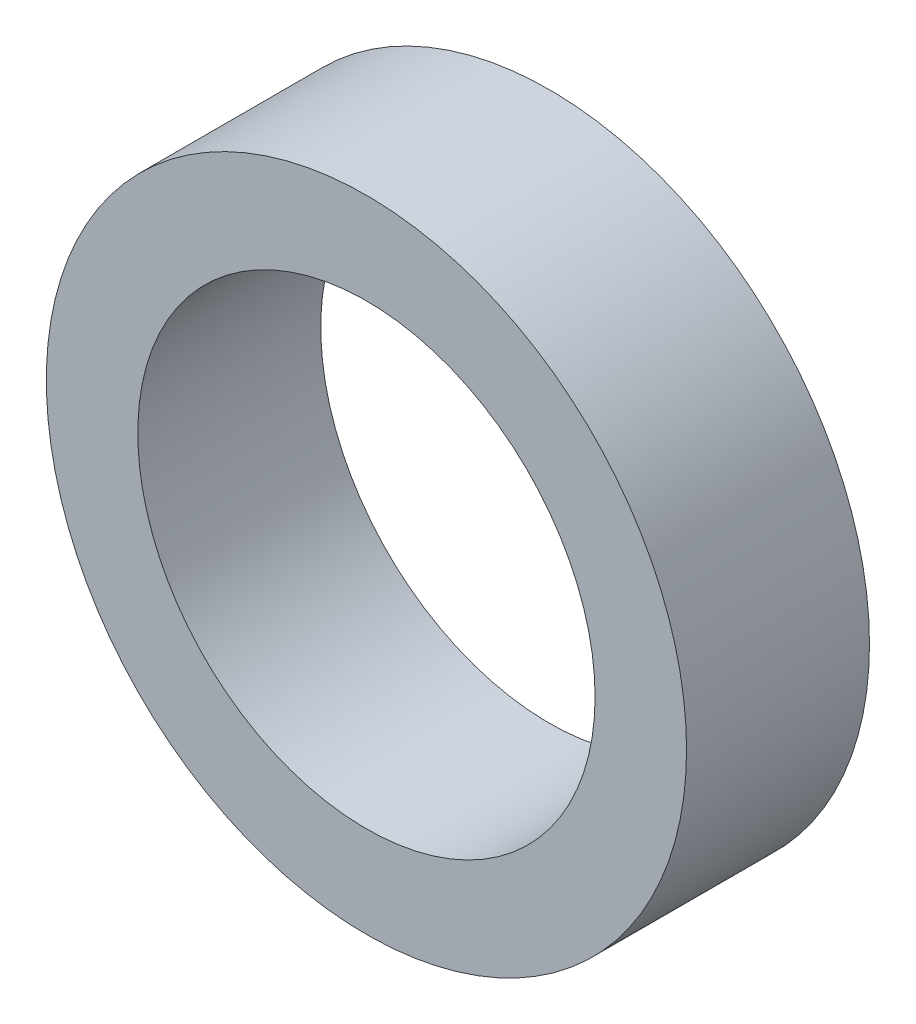
ISO-10303-21;
HEADER;
FILE_DESCRIPTION(('STEP AP214'),'2;1');
FILE_NAME('part.step','',(''),(''),'','','');
FILE_SCHEMA(('AUTOMOTIVE_DESIGN { 1 0 10303 214 1 1 1 1 }'));
ENDSEC;
DATA;
#1=APPLICATION_CONTEXT('core data for automotive mechanical design processes');
#2=APPLICATION_PROTOCOL_DEFINITION('international standard','automotive_design',2000,#1);
#3=PRODUCT_CONTEXT('',#1,'mechanical');
#4=PRODUCT('Part','Part','',(#3));
#5=PRODUCT_RELATED_PRODUCT_CATEGORY('part','',(#4));
#6=PRODUCT_DEFINITION_FORMATION('','',#4);
#7=PRODUCT_DEFINITION_CONTEXT('part definition',#1,'design');
#8=PRODUCT_DEFINITION('design','',#6,#7);
#9=PRODUCT_DEFINITION_SHAPE('','',#8);
#10=(LENGTH_UNIT() NAMED_UNIT(*) SI_UNIT(.MILLI.,.METRE.));
#11=(NAMED_UNIT(*) PLANE_ANGLE_UNIT() SI_UNIT($,.RADIAN.));
#12=(NAMED_UNIT(*) SI_UNIT($,.STERADIAN.) SOLID_ANGLE_UNIT());
#13=UNCERTAINTY_MEASURE_WITH_UNIT(LENGTH_MEASURE(1.E-05),#10,'distance_accuracy_value','');
#14=(GEOMETRIC_REPRESENTATION_CONTEXT(3) GLOBAL_UNCERTAINTY_ASSIGNED_CONTEXT((#13)) GLOBAL_UNIT_ASSIGNED_CONTEXT((#10,
#11,#12)) REPRESENTATION_CONTEXT('',''));
#15=CARTESIAN_POINT('',(0.,0.,0.));
#16=DIRECTION('',(0.,0.,1.));
#17=DIRECTION('',(1.,0.,0.));
#18=AXIS2_PLACEMENT_3D('',#15,#16,#17);
#19=CARTESIAN_POINT('',(0.,0.,6.35));
#20=DIRECTION('',(0.,0.,1.));
#21=DIRECTION('',(1.,0.,0.));
#22=AXIS2_PLACEMENT_3D('',#19,#20,#21);
#23=PLANE('',#22);
#24=CARTESIAN_POINT('',(0.,0.,6.35));
#25=DIRECTION('',(0.,0.,1.));
#26=DIRECTION('',(1.,0.,0.));
#27=AXIS2_PLACEMENT_3D('',#24,#25,#26);
#28=CIRCLE('',#27,11.1125);
#29=CARTESIAN_POINT('',(11.1125,0.,6.35));
#30=VERTEX_POINT('',#29);
#31=EDGE_CURVE('E10',#30,#30,#28,.T.);
#32=ORIENTED_EDGE('',*,*,#31,.T.);
#33=EDGE_LOOP('',(#32));
#34=FACE_BOUND('',#33,.T.);
#35=CARTESIAN_POINT('',(0.,0.,6.35));
#36=DIRECTION('',(0.,0.,1.));
#37=DIRECTION('',(1.,0.,0.));
#38=AXIS2_PLACEMENT_3D('',#35,#36,#37);
#39=CIRCLE('',#38,7.9375);
#40=CARTESIAN_POINT('',(7.9375,0.,6.35));
#41=VERTEX_POINT('',#40);
#42=EDGE_CURVE('E56',#41,#41,#39,.T.);
#43=ORIENTED_EDGE('',*,*,#42,.F.);
#44=EDGE_LOOP('',(#43));
#45=FACE_BOUND('',#44,.T.);
#46=ADVANCED_FACE('F43',(#34,#45),#23,.T.);
#47=CARTESIAN_POINT('',(0.,0.,0.));
#48=DIRECTION('',(0.,0.,1.));
#49=DIRECTION('',(1.,0.,0.));
#50=AXIS2_PLACEMENT_3D('',#47,#48,#49);
#51=PLANE('',#50);
#52=CARTESIAN_POINT('',(0.,0.,0.));
#53=DIRECTION('',(0.,0.,1.));
#54=DIRECTION('',(1.,0.,0.));
#55=AXIS2_PLACEMENT_3D('',#52,#53,#54);
#56=CIRCLE('',#55,11.1125);
#57=CARTESIAN_POINT('',(11.1125,0.,0.));
#58=VERTEX_POINT('',#57);
#59=EDGE_CURVE('E47',#58,#58,#56,.T.);
#60=ORIENTED_EDGE('',*,*,#59,.F.);
#61=EDGE_LOOP('',(#60));
#62=FACE_BOUND('',#61,.T.);
#63=CARTESIAN_POINT('',(0.,0.,0.));
#64=DIRECTION('',(0.,0.,1.));
#65=DIRECTION('',(1.,0.,0.));
#66=AXIS2_PLACEMENT_3D('',#63,#64,#65);
#67=CIRCLE('',#66,7.9375);
#68=CARTESIAN_POINT('',(7.9375,0.,0.));
#69=VERTEX_POINT('',#68);
#70=EDGE_CURVE('E58',#69,#69,#67,.T.);
#71=ORIENTED_EDGE('',*,*,#70,.T.);
#72=EDGE_LOOP('',(#71));
#73=FACE_BOUND('',#72,.T.);
#74=ADVANCED_FACE('F70',(#62,#73),#51,.F.);
#75=CARTESIAN_POINT('',(0.,0.,6.35));
#76=DIRECTION('',(0.,0.,-1.));
#77=DIRECTION('',(-1.,0.,0.));
#78=AXIS2_PLACEMENT_3D('',#75,#76,#77);
#79=CYLINDRICAL_SURFACE('',#78,11.1125);
#80=ORIENTED_EDGE('',*,*,#31,.F.);
#81=EDGE_LOOP('',(#80));
#82=FACE_BOUND('',#81,.T.);
#83=ORIENTED_EDGE('',*,*,#59,.T.);
#84=EDGE_LOOP('',(#83));
#85=FACE_BOUND('',#84,.T.);
#86=ADVANCED_FACE('F45',(#82,#85),#79,.T.);
#87=CARTESIAN_POINT('',(0.,0.,6.35));
#88=DIRECTION('',(0.,0.,-1.));
#89=DIRECTION('',(-1.,0.,0.));
#90=AXIS2_PLACEMENT_3D('',#87,#88,#89);
#91=CYLINDRICAL_SURFACE('',#90,7.9375);
#92=ORIENTED_EDGE('',*,*,#42,.T.);
#93=EDGE_LOOP('',(#92));
#94=FACE_BOUND('',#93,.T.);
#95=ORIENTED_EDGE('',*,*,#70,.F.);
#96=EDGE_LOOP('',(#95));
#97=FACE_BOUND('',#96,.T.);
#98=ADVANCED_FACE('F66',(#94,#97),#91,.F.);
#99=CLOSED_SHELL('',(#46,#74,#86,#98));
#100=MANIFOLD_SOLID_BREP('B2',#99);
#101=ADVANCED_BREP_SHAPE_REPRESENTATION('',(#18,#100),#14);
#102=SHAPE_DEFINITION_REPRESENTATION(#9,#101);
ENDSEC;
END-ISO-10303-21;
